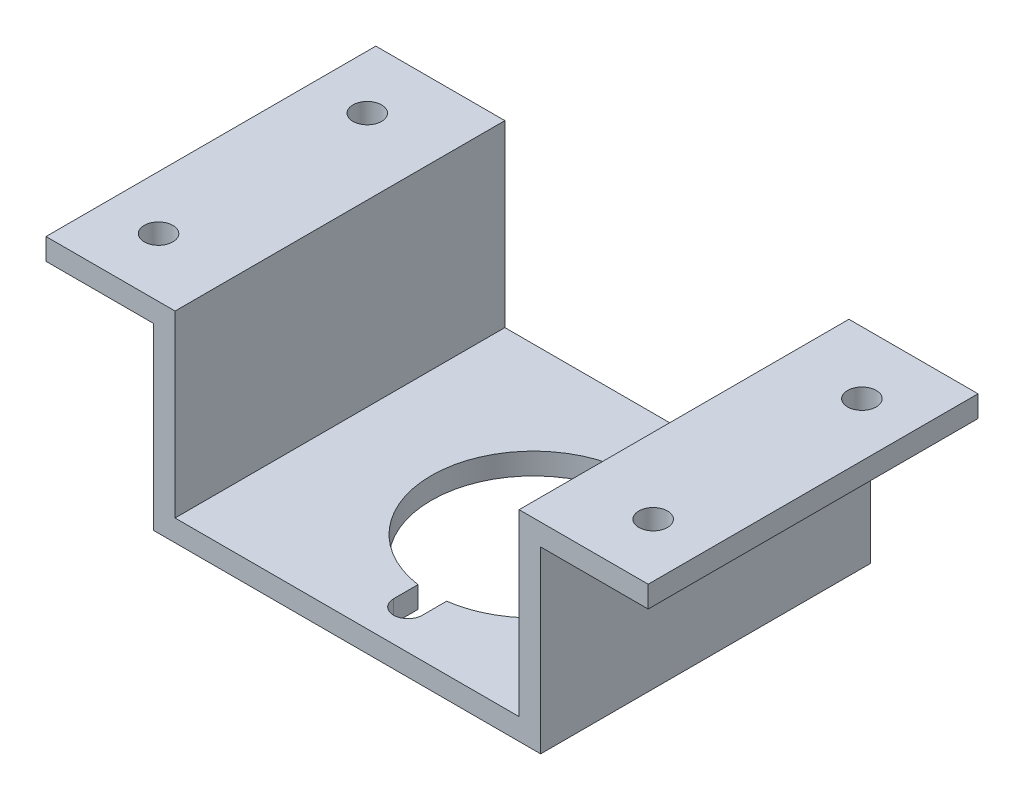
ISO-10303-21;
HEADER;
FILE_DESCRIPTION(('STEP AP214'),'2;1');
FILE_NAME('part.step','',(''),(''),'','','');
FILE_SCHEMA(('AUTOMOTIVE_DESIGN { 1 0 10303 214 1 1 1 1 }'));
ENDSEC;
DATA;
#1=APPLICATION_CONTEXT('core data for automotive mechanical design processes');
#2=APPLICATION_PROTOCOL_DEFINITION('international standard','automotive_design',2000,#1);
#3=PRODUCT_CONTEXT('',#1,'mechanical');
#4=PRODUCT('Part','Part','',(#3));
#5=PRODUCT_RELATED_PRODUCT_CATEGORY('part','',(#4));
#6=PRODUCT_DEFINITION_FORMATION('','',#4);
#7=PRODUCT_DEFINITION_CONTEXT('part definition',#1,'design');
#8=PRODUCT_DEFINITION('design','',#6,#7);
#9=PRODUCT_DEFINITION_SHAPE('','',#8);
#10=(LENGTH_UNIT() NAMED_UNIT(*) SI_UNIT(.MILLI.,.METRE.));
#11=(NAMED_UNIT(*) PLANE_ANGLE_UNIT() SI_UNIT($,.RADIAN.));
#12=(NAMED_UNIT(*) SI_UNIT($,.STERADIAN.) SOLID_ANGLE_UNIT());
#13=UNCERTAINTY_MEASURE_WITH_UNIT(LENGTH_MEASURE(1.E-05),#10,'distance_accuracy_value','');
#14=(GEOMETRIC_REPRESENTATION_CONTEXT(3) GLOBAL_UNCERTAINTY_ASSIGNED_CONTEXT((#13)) GLOBAL_UNIT_ASSIGNED_CONTEXT((#10,
#11,#12)) REPRESENTATION_CONTEXT('',''));
#15=CARTESIAN_POINT('',(0.,0.,0.));
#16=DIRECTION('',(0.,0.,1.));
#17=DIRECTION('',(1.,0.,0.));
#18=AXIS2_PLACEMENT_3D('',#15,#16,#17);
#19=CARTESIAN_POINT('',(-23.0659831417121,3.,-17.384827493882));
#20=DIRECTION('',(1.,0.,0.));
#21=DIRECTION('',(0.,0.,-1.));
#22=AXIS2_PLACEMENT_3D('',#19,#20,#21);
#23=PLANE('',#22);
#24=DIRECTION('',(0.,-1.,0.));
#25=VECTOR('',#24,1.);
#26=CARTESIAN_POINT('',(-23.0659831417121,28.,28.615172506118));
#27=LINE('',#26,#25);
#28=CARTESIAN_POINT('',(-23.0659831417121,25.,28.615172506118));
#29=VERTEX_POINT('',#28);
#30=CARTESIAN_POINT('',(-23.0659831417121,3.,28.615172506118));
#31=VERTEX_POINT('',#30);
#32=EDGE_CURVE('E58',#29,#31,#27,.T.);
#33=ORIENTED_EDGE('',*,*,#32,.F.);
#34=DIRECTION('',(0.,0.,1.));
#35=VECTOR('',#34,1.);
#36=CARTESIAN_POINT('',(-23.0659831417121,25.,-17.384827493882));
#37=LINE('',#36,#35);
#38=CARTESIAN_POINT('',(-23.0659831417121,25.,-17.384827493882));
#39=VERTEX_POINT('',#38);
#40=EDGE_CURVE('E291',#39,#29,#37,.T.);
#41=ORIENTED_EDGE('',*,*,#40,.F.);
#42=DIRECTION('',(0.,1.,0.));
#43=VECTOR('',#42,1.);
#44=CARTESIAN_POINT('',(-23.0659831417121,3.,-17.384827493882));
#45=LINE('',#44,#43);
#46=CARTESIAN_POINT('',(-23.0659831417121,0.,-17.384827493882));
#47=VERTEX_POINT('',#46);
#48=EDGE_CURVE('E340',#47,#39,#45,.T.);
#49=ORIENTED_EDGE('',*,*,#48,.F.);
#50=DIRECTION('',(0.,0.,1.));
#51=VECTOR('',#50,1.);
#52=CARTESIAN_POINT('',(-23.0659831417121,0.,-17.384827493882));
#53=LINE('',#52,#51);
#54=CARTESIAN_POINT('',(-23.0659831417121,0.,-14.384827493882));
#55=VERTEX_POINT('',#54);
#56=EDGE_CURVE('E345',#47,#55,#53,.T.);
#57=ORIENTED_EDGE('',*,*,#56,.T.);
#58=DIRECTION('',(0.,1.,0.));
#59=VECTOR('',#58,1.);
#60=CARTESIAN_POINT('',(-23.0659831417121,3.,-14.384827493882));
#61=LINE('',#60,#59);
#62=CARTESIAN_POINT('',(-23.0659831417121,3.,-14.384827493882));
#63=VERTEX_POINT('',#62);
#64=EDGE_CURVE('E337',#55,#63,#61,.T.);
#65=ORIENTED_EDGE('',*,*,#64,.T.);
#66=DIRECTION('',(0.,0.,1.));
#67=VECTOR('',#66,1.);
#68=CARTESIAN_POINT('',(-23.0659831417121,3.,-17.384827493882));
#69=LINE('',#68,#67);
#70=EDGE_CURVE('E296',#63,#31,#69,.T.);
#71=ORIENTED_EDGE('',*,*,#70,.T.);
#72=EDGE_LOOP('',(#33,#41,#49,#57,#65,#71));
#73=FACE_BOUND('',#72,.T.);
#74=ADVANCED_FACE('F35',(#73),#23,.F.);
#75=CARTESIAN_POINT('',(0.,3.,0.));
#76=DIRECTION('',(0.,1.,0.));
#77=DIRECTION('',(0.,0.,1.));
#78=AXIS2_PLACEMENT_3D('',#75,#76,#77);
#79=PLANE('',#78);
#80=DIRECTION('',(-1.,0.,0.));
#81=VECTOR('',#80,1.);
#82=CARTESIAN_POINT('',(-23.079062607331,3.,28.615172506118));
#83=LINE('',#82,#81);
#84=CARTESIAN_POINT('',(-23.079062607331,3.,28.615172506118));
#85=VERTEX_POINT('',#84);
#86=EDGE_CURVE('E334',#31,#85,#83,.T.);
#87=ORIENTED_EDGE('',*,*,#86,.F.);
#88=ORIENTED_EDGE('',*,*,#70,.F.);
#89=DIRECTION('',(-1.,0.,0.));
#90=VECTOR('',#89,1.);
#91=CARTESIAN_POINT('',(-23.079062607331,3.,-14.384827493882));
#92=LINE('',#91,#90);
#93=CARTESIAN_POINT('',(-23.079062607331,3.,-14.384827493882));
#94=VERTEX_POINT('',#93);
#95=EDGE_CURVE('E459',#63,#94,#92,.T.);
#96=ORIENTED_EDGE('',*,*,#95,.T.);
#97=DIRECTION('',(0.,0.,1.));
#98=VECTOR('',#97,1.);
#99=CARTESIAN_POINT('',(-23.079062607331,3.,-14.384827493882));
#100=LINE('',#99,#98);
#101=EDGE_CURVE('E456',#94,#85,#100,.T.);
#102=ORIENTED_EDGE('',*,*,#101,.T.);
#103=EDGE_LOOP('',(#87,#88,#96,#102));
#104=FACE_BOUND('',#103,.T.);
#105=ADVANCED_FACE('F553',(#104),#79,.T.);
#106=DIRECTION('',(0.,0.,-1.));
#107=VECTOR('',#106,1.);
#108=CARTESIAN_POINT('',(8.92093739266903,3.,23.115172506118));
#109=LINE('',#108,#107);
#110=CARTESIAN_POINT('',(8.92093739266903,3.,23.115172506118));
#111=VERTEX_POINT('',#110);
#112=CARTESIAN_POINT('',(8.92093739266903,3.,19.7241235656404));
#113=VERTEX_POINT('',#112);
#114=EDGE_CURVE('E354',#111,#113,#109,.T.);
#115=ORIENTED_EDGE('',*,*,#114,.F.);
#116=CARTESIAN_POINT('',(6.92093739266903,3.,23.115172506118));
#117=DIRECTION('',(0.,1.,0.));
#118=DIRECTION('',(0.,0.,1.));
#119=AXIS2_PLACEMENT_3D('',#116,#117,#118);
#120=CIRCLE('',#119,2.);
#121=CARTESIAN_POINT('',(4.92093739266903,3.,23.115172506118));
#122=VERTEX_POINT('',#121);
#123=EDGE_CURVE('E452',#122,#111,#120,.T.);
#124=ORIENTED_EDGE('',*,*,#123,.F.);
#125=DIRECTION('',(0.,0.,1.));
#126=VECTOR('',#125,1.);
#127=CARTESIAN_POINT('',(4.92093739266903,3.,-11.884827493882));
#128=LINE('',#127,#126);
#129=CARTESIAN_POINT('',(4.92093739266903,3.,19.7241235656405));
#130=VERTEX_POINT('',#129);
#131=EDGE_CURVE('E350',#130,#122,#128,.T.);
#132=ORIENTED_EDGE('',*,*,#131,.F.);
#133=CARTESIAN_POINT('',(6.92093739266903,3.,5.61517250611799));
#134=DIRECTION('',(0.,1.,0.));
#135=DIRECTION('',(0.,0.,1.));
#136=AXIS2_PLACEMENT_3D('',#133,#134,#135);
#137=CIRCLE('',#136,14.25);
#138=CARTESIAN_POINT('',(4.92093739266903,3.,-8.49377855340447));
#139=VERTEX_POINT('',#138);
#140=EDGE_CURVE('E421',#139,#130,#137,.T.);
#141=ORIENTED_EDGE('',*,*,#140,.F.);
#142=CARTESIAN_POINT('',(4.92093739266903,3.,-11.884827493882));
#143=VERTEX_POINT('',#142);
#144=EDGE_CURVE('E351',#143,#139,#128,.T.);
#145=ORIENTED_EDGE('',*,*,#144,.F.);
#146=CARTESIAN_POINT('',(6.92093739266903,3.,-11.884827493882));
#147=DIRECTION('',(0.,1.,0.));
#148=DIRECTION('',(0.,0.,1.));
#149=AXIS2_PLACEMENT_3D('',#146,#147,#148);
#150=CIRCLE('',#149,2.);
#151=CARTESIAN_POINT('',(8.92093739266903,3.,-11.884827493882));
#152=VERTEX_POINT('',#151);
#153=EDGE_CURVE('E437',#152,#143,#150,.T.);
#154=ORIENTED_EDGE('',*,*,#153,.F.);
#155=CARTESIAN_POINT('',(8.92093739266903,3.,-8.49377855340447));
#156=VERTEX_POINT('',#155);
#157=EDGE_CURVE('E353',#156,#152,#109,.T.);
#158=ORIENTED_EDGE('',*,*,#157,.F.);
#159=CARTESIAN_POINT('',(17.2661053468397,3.,-4.18482749388201));
#160=VERTEX_POINT('',#159);
#161=EDGE_CURVE('E417',#160,#156,#137,.T.);
#162=ORIENTED_EDGE('',*,*,#161,.F.);
#163=DIRECTION('',(-1.,0.,0.));
#164=VECTOR('',#163,1.);
#165=CARTESIAN_POINT('',(0.,3.,-4.18482749388201));
#166=LINE('',#165,#164);
#167=CARTESIAN_POINT('',(19.5682815384209,3.,-4.18482749388201));
#168=VERTEX_POINT('',#167);
#169=EDGE_CURVE('E384',#168,#160,#166,.T.);
#170=ORIENTED_EDGE('',*,*,#169,.F.);
#171=CARTESIAN_POINT('',(6.92093739266903,3.,5.61517250611799));
#172=DIRECTION('',(0.,1.,0.));
#173=DIRECTION('',(0.,0.,1.));
#174=AXIS2_PLACEMENT_3D('',#171,#172,#173);
#175=CIRCLE('',#174,15.9998535599887);
#176=CARTESIAN_POINT('',(21.1066807267733,3.,-1.78482749388201));
#177=VERTEX_POINT('',#176);
#178=EDGE_CURVE('E381',#177,#168,#175,.T.);
#179=ORIENTED_EDGE('',*,*,#178,.F.);
#180=DIRECTION('',(1.,0.,0.));
#181=VECTOR('',#180,1.);
#182=CARTESIAN_POINT('',(0.,3.,-1.78482749388201));
#183=LINE('',#182,#181);
#184=CARTESIAN_POINT('',(24.920937392669,3.,-1.78482749388201));
#185=VERTEX_POINT('',#184);
#186=EDGE_CURVE('E448',#177,#185,#183,.T.);
#187=ORIENTED_EDGE('',*,*,#186,.T.);
#188=DIRECTION('',(0.,0.,-1.));
#189=VECTOR('',#188,1.);
#190=CARTESIAN_POINT('',(24.920937392669,3.,13.015172506118));
#191=LINE('',#190,#189);
#192=CARTESIAN_POINT('',(24.920937392669,3.,13.015172506118));
#193=VERTEX_POINT('',#192);
#194=EDGE_CURVE('E424',#193,#185,#191,.T.);
#195=ORIENTED_EDGE('',*,*,#194,.F.);
#196=DIRECTION('',(1.,0.,0.));
#197=VECTOR('',#196,1.);
#198=CARTESIAN_POINT('',(0.,3.,13.015172506118));
#199=LINE('',#198,#197);
#200=CARTESIAN_POINT('',(21.1066807267733,3.,13.015172506118));
#201=VERTEX_POINT('',#200);
#202=EDGE_CURVE('E450',#201,#193,#199,.T.);
#203=ORIENTED_EDGE('',*,*,#202,.F.);
#204=CARTESIAN_POINT('',(6.92093739266903,3.,5.61517250611799));
#205=DIRECTION('',(0.,1.,0.));
#206=DIRECTION('',(0.,0.,1.));
#207=AXIS2_PLACEMENT_3D('',#204,#205,#206);
#208=CIRCLE('',#207,15.9998535599887);
#209=CARTESIAN_POINT('',(19.5682815384209,3.,15.415172506118));
#210=VERTEX_POINT('',#209);
#211=EDGE_CURVE('E395',#210,#201,#208,.T.);
#212=ORIENTED_EDGE('',*,*,#211,.F.);
#213=DIRECTION('',(-1.,0.,0.));
#214=VECTOR('',#213,1.);
#215=CARTESIAN_POINT('',(0.,3.,15.415172506118));
#216=LINE('',#215,#214);
#217=CARTESIAN_POINT('',(17.2661053468397,3.,15.415172506118));
#218=VERTEX_POINT('',#217);
#219=EDGE_CURVE('E392',#210,#218,#216,.T.);
#220=ORIENTED_EDGE('',*,*,#219,.T.);
#221=EDGE_CURVE('E415',#113,#218,#137,.T.);
#222=ORIENTED_EDGE('',*,*,#221,.F.);
#223=EDGE_LOOP('',(#115,#124,#132,#141,#145,#154,#158,#162,#170,#179,#187,#195,#203,#212,#220,#222));
#224=FACE_BOUND('',#223,.T.);
#225=DIRECTION('',(1.,0.,0.));
#226=VECTOR('',#225,1.);
#227=CARTESIAN_POINT('',(26.920937392669,3.,-17.384827493882));
#228=LINE('',#227,#226);
#229=CARTESIAN_POINT('',(-20.0659831417121,3.,-17.384827493882));
#230=VERTEX_POINT('',#229);
#231=CARTESIAN_POINT('',(27.920937392669,3.,-17.384827493882));
#232=VERTEX_POINT('',#231);
#233=EDGE_CURVE('E343',#230,#232,#228,.T.);
#234=ORIENTED_EDGE('',*,*,#233,.F.);
#235=DIRECTION('',(0.,0.,-1.));
#236=VECTOR('',#235,1.);
#237=CARTESIAN_POINT('',(-20.0659831417121,3.,-17.384827493882));
#238=LINE('',#237,#236);
#239=CARTESIAN_POINT('',(-20.0659831417121,3.,28.615172506118));
#240=VERTEX_POINT('',#239);
#241=EDGE_CURVE('E249',#240,#230,#238,.T.);
#242=ORIENTED_EDGE('',*,*,#241,.F.);
#243=CARTESIAN_POINT('',(27.920937392669,3.,28.615172506118));
#244=VERTEX_POINT('',#243);
#245=EDGE_CURVE('E335',#244,#240,#83,.T.);
#246=ORIENTED_EDGE('',*,*,#245,.F.);
#247=DIRECTION('',(0.,0.,1.));
#248=VECTOR('',#247,1.);
#249=CARTESIAN_POINT('',(27.920937392669,3.,-17.384827493882));
#250=LINE('',#249,#248);
#251=EDGE_CURVE('E307',#232,#244,#250,.T.);
#252=ORIENTED_EDGE('',*,*,#251,.F.);
#253=EDGE_LOOP('',(#234,#242,#246,#252));
#254=FACE_BOUND('',#253,.T.);
#255=ADVANCED_FACE('F481',(#224,#254),#79,.T.);
#256=CARTESIAN_POINT('',(-23.079062607331,3.,-14.384827493882));
#257=DIRECTION('',(0.,0.,1.));
#258=DIRECTION('',(1.,0.,0.));
#259=AXIS2_PLACEMENT_3D('',#256,#257,#258);
#260=PLANE('',#259);
#261=ORIENTED_EDGE('',*,*,#64,.F.);
#262=DIRECTION('',(-1.,0.,0.));
#263=VECTOR('',#262,1.);
#264=CARTESIAN_POINT('',(-23.079062607331,0.,-14.384827493882));
#265=LINE('',#264,#263);
#266=CARTESIAN_POINT('',(-23.079062607331,0.,-14.384827493882));
#267=VERTEX_POINT('',#266);
#268=EDGE_CURVE('E460',#55,#267,#265,.T.);
#269=ORIENTED_EDGE('',*,*,#268,.T.);
#270=DIRECTION('',(0.,-1.,0.));
#271=VECTOR('',#270,1.);
#272=CARTESIAN_POINT('',(-23.079062607331,3.,-14.384827493882));
#273=LINE('',#272,#271);
#274=EDGE_CURVE('E462',#94,#267,#273,.T.);
#275=ORIENTED_EDGE('',*,*,#274,.F.);
#276=ORIENTED_EDGE('',*,*,#95,.F.);
#277=EDGE_LOOP('',(#261,#269,#275,#276));
#278=FACE_BOUND('',#277,.T.);
#279=ADVANCED_FACE('F635',(#278),#260,.F.);
#280=CARTESIAN_POINT('',(6.92093739266903,4.,5.61517250611799));
#281=DIRECTION('',(0.,-1.,0.));
#282=DIRECTION('',(0.,0.,-1.));
#283=AXIS2_PLACEMENT_3D('',#280,#281,#282);
#284=CYLINDRICAL_SURFACE('',#283,14.25);
#285=ORIENTED_EDGE('',*,*,#161,.T.);
#286=DIRECTION('',(0.,-1.,0.));
#287=VECTOR('',#286,1.);
#288=CARTESIAN_POINT('',(8.92093739266903,4.,-8.49377855340447));
#289=LINE('',#288,#287);
#290=CARTESIAN_POINT('',(8.92093739266903,0.,-8.49377855340447));
#291=VERTEX_POINT('',#290);
#292=EDGE_CURVE('E371',#156,#291,#289,.T.);
#293=ORIENTED_EDGE('',*,*,#292,.T.);
#294=CARTESIAN_POINT('',(6.92093739266903,0.,5.61517250611799));
#295=DIRECTION('',(0.,-1.,0.));
#296=DIRECTION('',(0.,0.,-1.));
#297=AXIS2_PLACEMENT_3D('',#294,#295,#296);
#298=CIRCLE('',#297,14.25);
#299=CARTESIAN_POINT('',(17.2661053468397,0.,-4.18482749388201));
#300=VERTEX_POINT('',#299);
#301=EDGE_CURVE('E411',#291,#300,#298,.T.);
#302=ORIENTED_EDGE('',*,*,#301,.T.);
#303=DIRECTION('',(0.,-1.,0.));
#304=VECTOR('',#303,1.);
#305=CARTESIAN_POINT('',(17.2661053468397,4.,-4.18482749388201));
#306=LINE('',#305,#304);
#307=EDGE_CURVE('E470',#300,#160,#306,.F.);
#308=ORIENTED_EDGE('',*,*,#307,.T.);
#309=EDGE_LOOP('',(#285,#293,#302,#308));
#310=FACE_BOUND('',#309,.T.);
#311=ADVANCED_FACE('F515',(#310),#284,.F.);
#312=CARTESIAN_POINT('',(17.2661053468397,0.,15.415172506118));
#313=VERTEX_POINT('',#312);
#314=CARTESIAN_POINT('',(8.92093739266903,0.,19.7241235656404));
#315=VERTEX_POINT('',#314);
#316=EDGE_CURVE('E412',#313,#315,#298,.T.);
#317=ORIENTED_EDGE('',*,*,#316,.T.);
#318=DIRECTION('',(0.,-1.,0.));
#319=VECTOR('',#318,1.);
#320=CARTESIAN_POINT('',(8.92093739266903,4.,19.7241235656404));
#321=LINE('',#320,#319);
#322=EDGE_CURVE('E377',#315,#113,#321,.F.);
#323=ORIENTED_EDGE('',*,*,#322,.T.);
#324=ORIENTED_EDGE('',*,*,#221,.T.);
#325=DIRECTION('',(0.,-1.,0.));
#326=VECTOR('',#325,1.);
#327=CARTESIAN_POINT('',(17.2661053468397,4.,15.415172506118));
#328=LINE('',#327,#326);
#329=EDGE_CURVE('E467',#313,#218,#328,.F.);
#330=ORIENTED_EDGE('',*,*,#329,.F.);
#331=EDGE_LOOP('',(#317,#323,#324,#330));
#332=FACE_BOUND('',#331,.T.);
#333=ADVANCED_FACE('F490',(#332),#284,.F.);
#334=CARTESIAN_POINT('',(0.,0.,0.));
#335=DIRECTION('',(0.,1.,0.));
#336=DIRECTION('',(0.,0.,1.));
#337=AXIS2_PLACEMENT_3D('',#334,#335,#336);
#338=PLANE('',#337);
#339=DIRECTION('',(0.,0.,1.));
#340=VECTOR('',#339,1.);
#341=CARTESIAN_POINT('',(-23.079062607331,0.,-14.384827493882));
#342=LINE('',#341,#340);
#343=CARTESIAN_POINT('',(-23.079062607331,0.,28.615172506118));
#344=VERTEX_POINT('',#343);
#345=EDGE_CURVE('E455',#267,#344,#342,.T.);
#346=ORIENTED_EDGE('',*,*,#345,.F.);
#347=ORIENTED_EDGE('',*,*,#268,.F.);
#348=ORIENTED_EDGE('',*,*,#56,.F.);
#349=DIRECTION('',(-1.,0.,0.));
#350=VECTOR('',#349,1.);
#351=CARTESIAN_POINT('',(26.920937392669,0.,-17.384827493882));
#352=LINE('',#351,#350);
#353=CARTESIAN_POINT('',(30.920937392669,0.,-17.384827493882));
#354=VERTEX_POINT('',#353);
#355=EDGE_CURVE('E338',#354,#47,#352,.T.);
#356=ORIENTED_EDGE('',*,*,#355,.F.);
#357=DIRECTION('',(0.,0.,-1.));
#358=VECTOR('',#357,1.);
#359=CARTESIAN_POINT('',(30.920937392669,0.,28.615172506118));
#360=LINE('',#359,#358);
#361=CARTESIAN_POINT('',(30.920937392669,0.,28.615172506118));
#362=VERTEX_POINT('',#361);
#363=EDGE_CURVE('E324',#362,#354,#360,.T.);
#364=ORIENTED_EDGE('',*,*,#363,.F.);
#365=DIRECTION('',(1.,0.,0.));
#366=VECTOR('',#365,1.);
#367=CARTESIAN_POINT('',(-23.079062607331,0.,28.615172506118));
#368=LINE('',#367,#366);
#369=EDGE_CURVE('E331',#344,#362,#368,.T.);
#370=ORIENTED_EDGE('',*,*,#369,.F.);
#371=EDGE_LOOP('',(#346,#347,#348,#356,#364,#370));
#372=FACE_BOUND('',#371,.T.);
#373=CARTESIAN_POINT('',(6.92093739266903,0.,23.115172506118));
#374=DIRECTION('',(0.,-1.,0.));
#375=DIRECTION('',(0.,0.,-1.));
#376=AXIS2_PLACEMENT_3D('',#373,#374,#375);
#377=CIRCLE('',#376,2.);
#378=CARTESIAN_POINT('',(8.92093739266903,0.,23.115172506118));
#379=VERTEX_POINT('',#378);
#380=CARTESIAN_POINT('',(4.92093739266903,0.,23.115172506118));
#381=VERTEX_POINT('',#380);
#382=EDGE_CURVE('E434',#379,#381,#377,.T.);
#383=ORIENTED_EDGE('',*,*,#382,.F.);
#384=DIRECTION('',(0.,0.,-1.));
#385=VECTOR('',#384,1.);
#386=CARTESIAN_POINT('',(8.92093739266903,0.,0.));
#387=LINE('',#386,#385);
#388=EDGE_CURVE('E378',#379,#315,#387,.T.);
#389=ORIENTED_EDGE('',*,*,#388,.T.);
#390=ORIENTED_EDGE('',*,*,#316,.F.);
#391=DIRECTION('',(-1.,0.,0.));
#392=VECTOR('',#391,1.);
#393=CARTESIAN_POINT('',(0.,0.,15.415172506118));
#394=LINE('',#393,#392);
#395=CARTESIAN_POINT('',(19.5682815384209,0.,15.415172506118));
#396=VERTEX_POINT('',#395);
#397=EDGE_CURVE('E390',#396,#313,#394,.T.);
#398=ORIENTED_EDGE('',*,*,#397,.F.);
#399=CARTESIAN_POINT('',(6.92093739266903,0.,5.61517250611799));
#400=DIRECTION('',(0.,1.,0.));
#401=DIRECTION('',(0.,0.,1.));
#402=AXIS2_PLACEMENT_3D('',#399,#400,#401);
#403=CIRCLE('',#402,15.9998535599887);
#404=CARTESIAN_POINT('',(21.1066807267733,0.,13.015172506118));
#405=VERTEX_POINT('',#404);
#406=EDGE_CURVE('E408',#396,#405,#403,.T.);
#407=ORIENTED_EDGE('',*,*,#406,.T.);
#408=DIRECTION('',(-1.,0.,0.));
#409=VECTOR('',#408,1.);
#410=CARTESIAN_POINT('',(0.,0.,13.015172506118));
#411=LINE('',#410,#409);
#412=CARTESIAN_POINT('',(24.920937392669,0.,13.015172506118));
#413=VERTEX_POINT('',#412);
#414=EDGE_CURVE('E439',#413,#405,#411,.T.);
#415=ORIENTED_EDGE('',*,*,#414,.F.);
#416=DIRECTION('',(0.,0.,1.));
#417=VECTOR('',#416,1.);
#418=CARTESIAN_POINT('',(24.920937392669,0.,13.015172506118));
#419=LINE('',#418,#417);
#420=CARTESIAN_POINT('',(24.920937392669,0.,-1.78482749388201));
#421=VERTEX_POINT('',#420);
#422=EDGE_CURVE('E430',#421,#413,#419,.T.);
#423=ORIENTED_EDGE('',*,*,#422,.F.);
#424=DIRECTION('',(-1.,0.,0.));
#425=VECTOR('',#424,1.);
#426=CARTESIAN_POINT('',(0.,0.,-1.78482749388201));
#427=LINE('',#426,#425);
#428=CARTESIAN_POINT('',(21.1066807267733,0.,-1.78482749388201));
#429=VERTEX_POINT('',#428);
#430=EDGE_CURVE('E438',#421,#429,#427,.T.);
#431=ORIENTED_EDGE('',*,*,#430,.T.);
#432=CARTESIAN_POINT('',(6.92093739266903,0.,5.61517250611799));
#433=DIRECTION('',(0.,1.,0.));
#434=DIRECTION('',(0.,0.,1.));
#435=AXIS2_PLACEMENT_3D('',#432,#433,#434);
#436=CIRCLE('',#435,15.9998535599887);
#437=CARTESIAN_POINT('',(19.5682815384209,0.,-4.18482749388201));
#438=VERTEX_POINT('',#437);
#439=EDGE_CURVE('E405',#429,#438,#436,.T.);
#440=ORIENTED_EDGE('',*,*,#439,.T.);
#441=DIRECTION('',(-1.,0.,0.));
#442=VECTOR('',#441,1.);
#443=CARTESIAN_POINT('',(0.,0.,-4.18482749388201));
#444=LINE('',#443,#442);
#445=EDGE_CURVE('E402',#438,#300,#444,.T.);
#446=ORIENTED_EDGE('',*,*,#445,.T.);
#447=ORIENTED_EDGE('',*,*,#301,.F.);
#448=CARTESIAN_POINT('',(8.92093739266903,0.,-11.884827493882));
#449=VERTEX_POINT('',#448);
#450=EDGE_CURVE('E374',#291,#449,#387,.T.);
#451=ORIENTED_EDGE('',*,*,#450,.T.);
#452=CARTESIAN_POINT('',(6.92093739266903,0.,-11.884827493882));
#453=DIRECTION('',(0.,-1.,0.));
#454=DIRECTION('',(0.,0.,-1.));
#455=AXIS2_PLACEMENT_3D('',#452,#453,#454);
#456=CIRCLE('',#455,2.);
#457=CARTESIAN_POINT('',(4.92093739266903,0.,-11.884827493882));
#458=VERTEX_POINT('',#457);
#459=EDGE_CURVE('E433',#458,#449,#456,.T.);
#460=ORIENTED_EDGE('',*,*,#459,.F.);
#461=DIRECTION('',(0.,0.,1.));
#462=VECTOR('',#461,1.);
#463=CARTESIAN_POINT('',(4.92093739266903,0.,0.));
#464=LINE('',#463,#462);
#465=CARTESIAN_POINT('',(4.92093739266903,0.,-8.49377855340447));
#466=VERTEX_POINT('',#465);
#467=EDGE_CURVE('E368',#458,#466,#464,.T.);
#468=ORIENTED_EDGE('',*,*,#467,.T.);
#469=CARTESIAN_POINT('',(4.92093739266903,0.,19.7241235656405));
#470=VERTEX_POINT('',#469);
#471=EDGE_CURVE('E416',#470,#466,#298,.T.);
#472=ORIENTED_EDGE('',*,*,#471,.F.);
#473=EDGE_CURVE('E364',#470,#381,#464,.T.);
#474=ORIENTED_EDGE('',*,*,#473,.T.);
#475=EDGE_LOOP('',(#383,#389,#390,#398,#407,#415,#423,#431,#440,#446,#447,#451,#460,#468,#472,#474));
#476=FACE_BOUND('',#475,.T.);
#477=ADVANCED_FACE('F495',(#372,#476),#338,.F.);
#478=ORIENTED_EDGE('',*,*,#471,.T.);
#479=DIRECTION('',(0.,-1.,0.));
#480=VECTOR('',#479,1.);
#481=CARTESIAN_POINT('',(4.92093739266903,4.,-8.49377855340447));
#482=LINE('',#481,#480);
#483=EDGE_CURVE('E367',#466,#139,#482,.F.);
#484=ORIENTED_EDGE('',*,*,#483,.T.);
#485=ORIENTED_EDGE('',*,*,#140,.T.);
#486=DIRECTION('',(0.,-1.,0.));
#487=VECTOR('',#486,1.);
#488=CARTESIAN_POINT('',(4.92093739266903,4.,19.7241235656405));
#489=LINE('',#488,#487);
#490=EDGE_CURVE('E360',#130,#470,#489,.T.);
#491=ORIENTED_EDGE('',*,*,#490,.T.);
#492=EDGE_LOOP('',(#478,#484,#485,#491));
#493=FACE_BOUND('',#492,.T.);
#494=ADVANCED_FACE('F501',(#493),#284,.F.);
#495=CARTESIAN_POINT('',(-23.079062607331,3.,-14.384827493882));
#496=DIRECTION('',(1.,0.,0.));
#497=DIRECTION('',(0.,0.,-1.));
#498=AXIS2_PLACEMENT_3D('',#495,#496,#497);
#499=PLANE('',#498);
#500=ORIENTED_EDGE('',*,*,#345,.T.);
#501=DIRECTION('',(0.,-1.,0.));
#502=VECTOR('',#501,1.);
#503=CARTESIAN_POINT('',(-23.079062607331,3.,28.615172506118));
#504=LINE('',#503,#502);
#505=EDGE_CURVE('E329',#85,#344,#504,.T.);
#506=ORIENTED_EDGE('',*,*,#505,.F.);
#507=ORIENTED_EDGE('',*,*,#101,.F.);
#508=ORIENTED_EDGE('',*,*,#274,.T.);
#509=EDGE_LOOP('',(#500,#506,#507,#508));
#510=FACE_BOUND('',#509,.T.);
#511=ADVANCED_FACE('F37',(#510),#499,.F.);
#512=CARTESIAN_POINT('',(6.92093739266903,5.,-11.884827493882));
#513=DIRECTION('',(0.,-1.,0.));
#514=DIRECTION('',(0.,0.,-1.));
#515=AXIS2_PLACEMENT_3D('',#512,#513,#514);
#516=CYLINDRICAL_SURFACE('',#515,2.);
#517=ORIENTED_EDGE('',*,*,#459,.T.);
#518=DIRECTION('',(0.,1.,0.));
#519=VECTOR('',#518,1.);
#520=CARTESIAN_POINT('',(8.92093739266903,-2.,-11.884827493882));
#521=LINE('',#520,#519);
#522=EDGE_CURVE('E357',#449,#152,#521,.T.);
#523=ORIENTED_EDGE('',*,*,#522,.T.);
#524=ORIENTED_EDGE('',*,*,#153,.T.);
#525=DIRECTION('',(0.,1.,0.));
#526=VECTOR('',#525,1.);
#527=CARTESIAN_POINT('',(4.92093739266903,-2.,-11.884827493882));
#528=LINE('',#527,#526);
#529=EDGE_CURVE('E356',#458,#143,#528,.T.);
#530=ORIENTED_EDGE('',*,*,#529,.F.);
#531=EDGE_LOOP('',(#517,#523,#524,#530));
#532=FACE_BOUND('',#531,.T.);
#533=ADVANCED_FACE('F508',(#532),#516,.F.);
#534=CARTESIAN_POINT('',(0.,5.,13.015172506118));
#535=DIRECTION('',(0.,0.,1.));
#536=DIRECTION('',(1.,0.,0.));
#537=AXIS2_PLACEMENT_3D('',#534,#535,#536);
#538=PLANE('',#537);
#539=ORIENTED_EDGE('',*,*,#414,.T.);
#540=DIRECTION('',(0.,1.,0.));
#541=VECTOR('',#540,1.);
#542=CARTESIAN_POINT('',(21.1066807267733,-1.,13.015172506118));
#543=LINE('',#542,#541);
#544=EDGE_CURVE('E385',#405,#201,#543,.T.);
#545=ORIENTED_EDGE('',*,*,#544,.T.);
#546=ORIENTED_EDGE('',*,*,#202,.T.);
#547=DIRECTION('',(0.,1.,0.));
#548=VECTOR('',#547,1.);
#549=CARTESIAN_POINT('',(24.920937392669,0.,13.015172506118));
#550=LINE('',#549,#548);
#551=EDGE_CURVE('E420',#413,#193,#550,.T.);
#552=ORIENTED_EDGE('',*,*,#551,.F.);
#553=EDGE_LOOP('',(#539,#545,#546,#552));
#554=FACE_BOUND('',#553,.T.);
#555=ADVANCED_FACE('F536',(#554),#538,.F.);
#556=CARTESIAN_POINT('',(0.,5.,-1.78482749388201));
#557=DIRECTION('',(0.,0.,1.));
#558=DIRECTION('',(1.,0.,0.));
#559=AXIS2_PLACEMENT_3D('',#556,#557,#558);
#560=PLANE('',#559);
#561=DIRECTION('',(0.,1.,0.));
#562=VECTOR('',#561,1.);
#563=CARTESIAN_POINT('',(21.1066807267733,-1.,-1.78482749388201));
#564=LINE('',#563,#562);
#565=EDGE_CURVE('E387',#429,#177,#564,.T.);
#566=ORIENTED_EDGE('',*,*,#565,.F.);
#567=ORIENTED_EDGE('',*,*,#430,.F.);
#568=DIRECTION('',(0.,-1.,0.));
#569=VECTOR('',#568,1.);
#570=CARTESIAN_POINT('',(24.920937392669,0.,-1.78482749388201));
#571=LINE('',#570,#569);
#572=EDGE_CURVE('E427',#185,#421,#571,.T.);
#573=ORIENTED_EDGE('',*,*,#572,.F.);
#574=ORIENTED_EDGE('',*,*,#186,.F.);
#575=EDGE_LOOP('',(#566,#567,#573,#574));
#576=FACE_BOUND('',#575,.T.);
#577=ADVANCED_FACE('F528',(#576),#560,.T.);
#578=CARTESIAN_POINT('',(6.92093739266903,5.,23.115172506118));
#579=DIRECTION('',(0.,-1.,0.));
#580=DIRECTION('',(0.,0.,-1.));
#581=AXIS2_PLACEMENT_3D('',#578,#579,#580);
#582=CYLINDRICAL_SURFACE('',#581,2.);
#583=ORIENTED_EDGE('',*,*,#123,.T.);
#584=DIRECTION('',(0.,-1.,0.));
#585=VECTOR('',#584,1.);
#586=CARTESIAN_POINT('',(8.92093739266903,5.,23.115172506118));
#587=LINE('',#586,#585);
#588=EDGE_CURVE('E11',#111,#379,#587,.T.);
#589=ORIENTED_EDGE('',*,*,#588,.T.);
#590=ORIENTED_EDGE('',*,*,#382,.T.);
#591=DIRECTION('',(0.,-1.,0.));
#592=VECTOR('',#591,1.);
#593=CARTESIAN_POINT('',(4.92093739266903,5.,23.115172506118));
#594=LINE('',#593,#592);
#595=EDGE_CURVE('E43',#381,#122,#594,.F.);
#596=ORIENTED_EDGE('',*,*,#595,.T.);
#597=EDGE_LOOP('',(#583,#589,#590,#596));
#598=FACE_BOUND('',#597,.T.);
#599=ADVANCED_FACE('F475',(#598),#582,.F.);
#600=CARTESIAN_POINT('',(24.920937392669,0.,0.));
#601=DIRECTION('',(-1.,0.,0.));
#602=DIRECTION('',(0.,0.,1.));
#603=AXIS2_PLACEMENT_3D('',#600,#601,#602);
#604=PLANE('',#603);
#605=ORIENTED_EDGE('',*,*,#551,.T.);
#606=ORIENTED_EDGE('',*,*,#194,.T.);
#607=ORIENTED_EDGE('',*,*,#572,.T.);
#608=ORIENTED_EDGE('',*,*,#422,.T.);
#609=EDGE_LOOP('',(#605,#606,#607,#608));
#610=FACE_BOUND('',#609,.T.);
#611=ADVANCED_FACE('F531',(#610),#604,.T.);
#612=CARTESIAN_POINT('',(6.92093739266903,-1.,5.61517250611799));
#613=DIRECTION('',(0.,1.,0.));
#614=DIRECTION('',(0.,0.,1.));
#615=AXIS2_PLACEMENT_3D('',#612,#613,#614);
#616=CYLINDRICAL_SURFACE('',#615,15.9998535599887);
#617=DIRECTION('',(0.,1.,0.));
#618=VECTOR('',#617,1.);
#619=CARTESIAN_POINT('',(19.5682815384209,-1.,15.415172506118));
#620=LINE('',#619,#618);
#621=EDGE_CURVE('E397',#396,#210,#620,.T.);
#622=ORIENTED_EDGE('',*,*,#621,.T.);
#623=ORIENTED_EDGE('',*,*,#211,.T.);
#624=ORIENTED_EDGE('',*,*,#544,.F.);
#625=ORIENTED_EDGE('',*,*,#406,.F.);
#626=EDGE_LOOP('',(#622,#623,#624,#625));
#627=FACE_BOUND('',#626,.T.);
#628=ADVANCED_FACE('F538',(#627),#616,.F.);
#629=CARTESIAN_POINT('',(0.,-1.,15.415172506118));
#630=DIRECTION('',(0.,0.,-1.));
#631=DIRECTION('',(-1.,0.,0.));
#632=AXIS2_PLACEMENT_3D('',#629,#630,#631);
#633=PLANE('',#632);
#634=ORIENTED_EDGE('',*,*,#397,.T.);
#635=ORIENTED_EDGE('',*,*,#329,.T.);
#636=ORIENTED_EDGE('',*,*,#219,.F.);
#637=ORIENTED_EDGE('',*,*,#621,.F.);
#638=EDGE_LOOP('',(#634,#635,#636,#637));
#639=FACE_BOUND('',#638,.T.);
#640=ADVANCED_FACE('F542',(#639),#633,.T.);
#641=CARTESIAN_POINT('',(6.92093739266903,-1.,5.61517250611799));
#642=DIRECTION('',(0.,1.,0.));
#643=DIRECTION('',(0.,0.,1.));
#644=AXIS2_PLACEMENT_3D('',#641,#642,#643);
#645=CYLINDRICAL_SURFACE('',#644,15.9998535599887);
#646=ORIENTED_EDGE('',*,*,#565,.T.);
#647=ORIENTED_EDGE('',*,*,#178,.T.);
#648=DIRECTION('',(0.,1.,0.));
#649=VECTOR('',#648,1.);
#650=CARTESIAN_POINT('',(19.5682815384209,-1.,-4.18482749388201));
#651=LINE('',#650,#649);
#652=EDGE_CURVE('E388',#438,#168,#651,.T.);
#653=ORIENTED_EDGE('',*,*,#652,.F.);
#654=ORIENTED_EDGE('',*,*,#439,.F.);
#655=EDGE_LOOP('',(#646,#647,#653,#654));
#656=FACE_BOUND('',#655,.T.);
#657=ADVANCED_FACE('F540',(#656),#645,.F.);
#658=CARTESIAN_POINT('',(0.,-1.,-4.18482749388201));
#659=DIRECTION('',(0.,0.,-1.));
#660=DIRECTION('',(-1.,0.,0.));
#661=AXIS2_PLACEMENT_3D('',#658,#659,#660);
#662=PLANE('',#661);
#663=ORIENTED_EDGE('',*,*,#652,.T.);
#664=ORIENTED_EDGE('',*,*,#169,.T.);
#665=ORIENTED_EDGE('',*,*,#307,.F.);
#666=ORIENTED_EDGE('',*,*,#445,.F.);
#667=EDGE_LOOP('',(#663,#664,#665,#666));
#668=FACE_BOUND('',#667,.T.);
#669=ADVANCED_FACE('F518',(#668),#662,.F.);
#670=CARTESIAN_POINT('',(4.92093739266903,-2.,-11.884827493882));
#671=DIRECTION('',(-1.,0.,0.));
#672=DIRECTION('',(0.,0.,1.));
#673=AXIS2_PLACEMENT_3D('',#670,#671,#672);
#674=PLANE('',#673);
#675=ORIENTED_EDGE('',*,*,#490,.F.);
#676=ORIENTED_EDGE('',*,*,#131,.T.);
#677=ORIENTED_EDGE('',*,*,#595,.F.);
#678=ORIENTED_EDGE('',*,*,#473,.F.);
#679=EDGE_LOOP('',(#675,#676,#677,#678));
#680=FACE_BOUND('',#679,.T.);
#681=ADVANCED_FACE('F499',(#680),#674,.F.);
#682=CARTESIAN_POINT('',(8.92093739266903,-2.,23.115172506118));
#683=DIRECTION('',(1.,0.,0.));
#684=DIRECTION('',(0.,0.,-1.));
#685=AXIS2_PLACEMENT_3D('',#682,#683,#684);
#686=PLANE('',#685);
#687=ORIENTED_EDGE('',*,*,#588,.F.);
#688=ORIENTED_EDGE('',*,*,#114,.T.);
#689=ORIENTED_EDGE('',*,*,#322,.F.);
#690=ORIENTED_EDGE('',*,*,#388,.F.);
#691=EDGE_LOOP('',(#687,#688,#689,#690));
#692=FACE_BOUND('',#691,.T.);
#693=ADVANCED_FACE('F487',(#692),#686,.F.);
#694=ORIENTED_EDGE('',*,*,#529,.T.);
#695=ORIENTED_EDGE('',*,*,#144,.T.);
#696=ORIENTED_EDGE('',*,*,#483,.F.);
#697=ORIENTED_EDGE('',*,*,#467,.F.);
#698=EDGE_LOOP('',(#694,#695,#696,#697));
#699=FACE_BOUND('',#698,.T.);
#700=ADVANCED_FACE('F567',(#699),#674,.F.);
#701=ORIENTED_EDGE('',*,*,#292,.F.);
#702=ORIENTED_EDGE('',*,*,#157,.T.);
#703=ORIENTED_EDGE('',*,*,#522,.F.);
#704=ORIENTED_EDGE('',*,*,#450,.F.);
#705=EDGE_LOOP('',(#701,#702,#703,#704));
#706=FACE_BOUND('',#705,.T.);
#707=ADVANCED_FACE('F511',(#706),#686,.F.);
#708=CARTESIAN_POINT('',(0.,0.,-17.384827493882));
#709=DIRECTION('',(0.,0.,-1.));
#710=DIRECTION('',(-1.,0.,0.));
#711=AXIS2_PLACEMENT_3D('',#708,#709,#710);
#712=PLANE('',#711);
#713=ORIENTED_EDGE('',*,*,#48,.T.);
#714=DIRECTION('',(1.,0.,0.));
#715=VECTOR('',#714,1.);
#716=CARTESIAN_POINT('',(-38.0659831417121,25.,-17.384827493882));
#717=LINE('',#716,#715);
#718=CARTESIAN_POINT('',(-38.0659831417121,25.,-17.384827493882));
#719=VERTEX_POINT('',#718);
#720=EDGE_CURVE('E259',#719,#39,#717,.T.);
#721=ORIENTED_EDGE('',*,*,#720,.F.);
#722=DIRECTION('',(0.,-1.,0.));
#723=VECTOR('',#722,1.);
#724=CARTESIAN_POINT('',(-38.0659831417121,28.,-17.384827493882));
#725=LINE('',#724,#723);
#726=CARTESIAN_POINT('',(-38.0659831417121,28.,-17.384827493882));
#727=VERTEX_POINT('',#726);
#728=EDGE_CURVE('E292',#727,#719,#725,.T.);
#729=ORIENTED_EDGE('',*,*,#728,.F.);
#730=DIRECTION('',(-1.,0.,0.));
#731=VECTOR('',#730,1.);
#732=CARTESIAN_POINT('',(-23.0659831417121,28.,-17.384827493882));
#733=LINE('',#732,#731);
#734=CARTESIAN_POINT('',(-20.0659831417121,28.,-17.384827493882));
#735=VERTEX_POINT('',#734);
#736=EDGE_CURVE('E255',#735,#727,#733,.T.);
#737=ORIENTED_EDGE('',*,*,#736,.F.);
#738=DIRECTION('',(0.,-1.,0.));
#739=VECTOR('',#738,1.);
#740=CARTESIAN_POINT('',(-20.0659831417121,28.,-17.384827493882));
#741=LINE('',#740,#739);
#742=EDGE_CURVE('E300',#735,#230,#741,.T.);
#743=ORIENTED_EDGE('',*,*,#742,.T.);
#744=ORIENTED_EDGE('',*,*,#233,.T.);
#745=DIRECTION('',(0.,-1.,0.));
#746=VECTOR('',#745,1.);
#747=CARTESIAN_POINT('',(27.920937392669,28.,-17.384827493882));
#748=LINE('',#747,#746);
#749=CARTESIAN_POINT('',(27.920937392669,28.,-17.384827493882));
#750=VERTEX_POINT('',#749);
#751=EDGE_CURVE('E319',#750,#232,#748,.T.);
#752=ORIENTED_EDGE('',*,*,#751,.F.);
#753=DIRECTION('',(-1.,0.,0.));
#754=VECTOR('',#753,1.);
#755=CARTESIAN_POINT('',(30.920937392669,28.,-17.384827493882));
#756=LINE('',#755,#754);
#757=CARTESIAN_POINT('',(45.920937392669,28.,-17.384827493882));
#758=VERTEX_POINT('',#757);
#759=EDGE_CURVE('E308',#758,#750,#756,.T.);
#760=ORIENTED_EDGE('',*,*,#759,.F.);
#761=DIRECTION('',(0.,1.,0.));
#762=VECTOR('',#761,1.);
#763=CARTESIAN_POINT('',(45.920937392669,28.,-17.384827493882));
#764=LINE('',#763,#762);
#765=CARTESIAN_POINT('',(45.920937392669,25.,-17.384827493882));
#766=VERTEX_POINT('',#765);
#767=EDGE_CURVE('E278',#766,#758,#764,.T.);
#768=ORIENTED_EDGE('',*,*,#767,.F.);
#769=DIRECTION('',(-1.,0.,0.));
#770=VECTOR('',#769,1.);
#771=CARTESIAN_POINT('',(45.920937392669,25.,-17.384827493882));
#772=LINE('',#771,#770);
#773=CARTESIAN_POINT('',(30.920937392669,25.,-17.384827493882));
#774=VERTEX_POINT('',#773);
#775=EDGE_CURVE('E284',#766,#774,#772,.T.);
#776=ORIENTED_EDGE('',*,*,#775,.T.);
#777=DIRECTION('',(0.,1.,0.));
#778=VECTOR('',#777,1.);
#779=CARTESIAN_POINT('',(30.920937392669,3.,-17.384827493882));
#780=LINE('',#779,#778);
#781=EDGE_CURVE('E327',#354,#774,#780,.T.);
#782=ORIENTED_EDGE('',*,*,#781,.F.);
#783=ORIENTED_EDGE('',*,*,#355,.T.);
#784=EDGE_LOOP('',(#713,#721,#729,#737,#743,#744,#752,#760,#768,#776,#782,#783));
#785=FACE_BOUND('',#784,.T.);
#786=ADVANCED_FACE('F563',(#785),#712,.T.);
#787=CARTESIAN_POINT('',(0.,0.,28.615172506118));
#788=DIRECTION('',(0.,0.,1.));
#789=DIRECTION('',(1.,0.,0.));
#790=AXIS2_PLACEMENT_3D('',#787,#788,#789);
#791=PLANE('',#790);
#792=ORIENTED_EDGE('',*,*,#505,.T.);
#793=ORIENTED_EDGE('',*,*,#369,.T.);
#794=DIRECTION('',(0.,-1.,0.));
#795=VECTOR('',#794,1.);
#796=CARTESIAN_POINT('',(30.920937392669,3.,28.615172506118));
#797=LINE('',#796,#795);
#798=CARTESIAN_POINT('',(30.920937392669,25.,28.615172506118));
#799=VERTEX_POINT('',#798);
#800=EDGE_CURVE('E322',#799,#362,#797,.T.);
#801=ORIENTED_EDGE('',*,*,#800,.F.);
#802=DIRECTION('',(-1.,0.,0.));
#803=VECTOR('',#802,1.);
#804=CARTESIAN_POINT('',(45.920937392669,25.,28.615172506118));
#805=LINE('',#804,#803);
#806=CARTESIAN_POINT('',(45.920937392669,25.,28.615172506118));
#807=VERTEX_POINT('',#806);
#808=EDGE_CURVE('E288',#807,#799,#805,.T.);
#809=ORIENTED_EDGE('',*,*,#808,.F.);
#810=DIRECTION('',(0.,-1.,0.));
#811=VECTOR('',#810,1.);
#812=CARTESIAN_POINT('',(45.920937392669,28.,28.615172506118));
#813=LINE('',#812,#811);
#814=CARTESIAN_POINT('',(45.920937392669,28.,28.615172506118));
#815=VERTEX_POINT('',#814);
#816=EDGE_CURVE('E273',#815,#807,#813,.T.);
#817=ORIENTED_EDGE('',*,*,#816,.F.);
#818=DIRECTION('',(1.,0.,0.));
#819=VECTOR('',#818,1.);
#820=CARTESIAN_POINT('',(30.920937392669,28.,28.615172506118));
#821=LINE('',#820,#819);
#822=CARTESIAN_POINT('',(27.920937392669,28.,28.615172506118));
#823=VERTEX_POINT('',#822);
#824=EDGE_CURVE('E312',#823,#815,#821,.T.);
#825=ORIENTED_EDGE('',*,*,#824,.F.);
#826=DIRECTION('',(0.,-1.,0.));
#827=VECTOR('',#826,1.);
#828=CARTESIAN_POINT('',(27.920937392669,28.,28.615172506118));
#829=LINE('',#828,#827);
#830=EDGE_CURVE('E314',#823,#244,#829,.T.);
#831=ORIENTED_EDGE('',*,*,#830,.T.);
#832=ORIENTED_EDGE('',*,*,#245,.T.);
#833=DIRECTION('',(0.,-1.,0.));
#834=VECTOR('',#833,1.);
#835=CARTESIAN_POINT('',(-20.0659831417121,28.,28.615172506118));
#836=LINE('',#835,#834);
#837=CARTESIAN_POINT('',(-20.0659831417121,28.,28.615172506118));
#838=VERTEX_POINT('',#837);
#839=EDGE_CURVE('E245',#838,#240,#836,.T.);
#840=ORIENTED_EDGE('',*,*,#839,.F.);
#841=DIRECTION('',(1.,0.,0.));
#842=VECTOR('',#841,1.);
#843=CARTESIAN_POINT('',(-23.0659831417121,28.,28.615172506118));
#844=LINE('',#843,#842);
#845=CARTESIAN_POINT('',(-38.0659831417121,28.,28.615172506118));
#846=VERTEX_POINT('',#845);
#847=EDGE_CURVE('E238',#846,#838,#844,.T.);
#848=ORIENTED_EDGE('',*,*,#847,.F.);
#849=DIRECTION('',(0.,1.,0.));
#850=VECTOR('',#849,1.);
#851=CARTESIAN_POINT('',(-38.0659831417121,28.,28.615172506118));
#852=LINE('',#851,#850);
#853=CARTESIAN_POINT('',(-38.0659831417121,25.,28.615172506118));
#854=VERTEX_POINT('',#853);
#855=EDGE_CURVE('E243',#854,#846,#852,.T.);
#856=ORIENTED_EDGE('',*,*,#855,.F.);
#857=DIRECTION('',(1.,0.,0.));
#858=VECTOR('',#857,1.);
#859=CARTESIAN_POINT('',(-38.0659831417121,25.,28.615172506118));
#860=LINE('',#859,#858);
#861=EDGE_CURVE('E264',#854,#29,#860,.T.);
#862=ORIENTED_EDGE('',*,*,#861,.T.);
#863=ORIENTED_EDGE('',*,*,#32,.T.);
#864=ORIENTED_EDGE('',*,*,#86,.T.);
#865=EDGE_LOOP('',(#792,#793,#801,#809,#817,#825,#831,#832,#840,#848,#856,#862,#863,#864));
#866=FACE_BOUND('',#865,.T.);
#867=ADVANCED_FACE('F241',(#866),#791,.T.);
#868=CARTESIAN_POINT('',(30.920937392669,0.,0.));
#869=DIRECTION('',(1.,0.,0.));
#870=DIRECTION('',(0.,0.,-1.));
#871=AXIS2_PLACEMENT_3D('',#868,#869,#870);
#872=PLANE('',#871);
#873=DIRECTION('',(0.,0.,-1.));
#874=VECTOR('',#873,1.);
#875=CARTESIAN_POINT('',(30.920937392669,25.,28.615172506118));
#876=LINE('',#875,#874);
#877=EDGE_CURVE('E50',#799,#774,#876,.T.);
#878=ORIENTED_EDGE('',*,*,#877,.F.);
#879=ORIENTED_EDGE('',*,*,#800,.T.);
#880=ORIENTED_EDGE('',*,*,#363,.T.);
#881=ORIENTED_EDGE('',*,*,#781,.T.);
#882=EDGE_LOOP('',(#878,#879,#880,#881));
#883=FACE_BOUND('',#882,.T.);
#884=ADVANCED_FACE('F656',(#883),#872,.T.);
#885=CARTESIAN_POINT('',(27.920937392669,28.,-17.384827493882));
#886=DIRECTION('',(1.,0.,0.));
#887=DIRECTION('',(0.,0.,-1.));
#888=AXIS2_PLACEMENT_3D('',#885,#886,#887);
#889=PLANE('',#888);
#890=ORIENTED_EDGE('',*,*,#251,.T.);
#891=ORIENTED_EDGE('',*,*,#830,.F.);
#892=DIRECTION('',(0.,0.,1.));
#893=VECTOR('',#892,1.);
#894=CARTESIAN_POINT('',(27.920937392669,28.,-17.384827493882));
#895=LINE('',#894,#893);
#896=EDGE_CURVE('E310',#750,#823,#895,.T.);
#897=ORIENTED_EDGE('',*,*,#896,.F.);
#898=ORIENTED_EDGE('',*,*,#751,.T.);
#899=EDGE_LOOP('',(#890,#891,#897,#898));
#900=FACE_BOUND('',#899,.T.);
#901=ADVANCED_FACE('F650',(#900),#889,.F.);
#902=CARTESIAN_POINT('',(0.,28.,0.));
#903=DIRECTION('',(0.,-1.,0.));
#904=DIRECTION('',(0.,0.,-1.));
#905=AXIS2_PLACEMENT_3D('',#902,#903,#904);
#906=PLANE('',#905);
#907=CARTESIAN_POINT('',(38.420937392669,28.,20.4195203322049));
#908=DIRECTION('',(0.,-1.,0.));
#909=DIRECTION('',(0.,0.,-1.));
#910=AXIS2_PLACEMENT_3D('',#907,#908,#909);
#911=CIRCLE('',#910,2.);
#912=CARTESIAN_POINT('',(38.420937392669,28.,18.4195203322049));
#913=VERTEX_POINT('',#912);
#914=EDGE_CURVE('E265',#913,#913,#911,.T.);
#915=ORIENTED_EDGE('',*,*,#914,.T.);
#916=EDGE_LOOP('',(#915));
#917=FACE_BOUND('',#916,.T.);
#918=CARTESIAN_POINT('',(38.420937392669,28.,-8.69241374694101));
#919=DIRECTION('',(0.,-1.,0.));
#920=DIRECTION('',(0.,0.,-1.));
#921=AXIS2_PLACEMENT_3D('',#918,#919,#920);
#922=CIRCLE('',#921,2.);
#923=CARTESIAN_POINT('',(38.420937392669,28.,-10.692413746941));
#924=VERTEX_POINT('',#923);
#925=EDGE_CURVE('E269',#924,#924,#922,.T.);
#926=ORIENTED_EDGE('',*,*,#925,.T.);
#927=EDGE_LOOP('',(#926));
#928=FACE_BOUND('',#927,.T.);
#929=ORIENTED_EDGE('',*,*,#824,.T.);
#930=DIRECTION('',(0.,0.,1.));
#931=VECTOR('',#930,1.);
#932=CARTESIAN_POINT('',(45.920937392669,28.,28.615172506118));
#933=LINE('',#932,#931);
#934=EDGE_CURVE('E281',#758,#815,#933,.T.);
#935=ORIENTED_EDGE('',*,*,#934,.F.);
#936=ORIENTED_EDGE('',*,*,#759,.T.);
#937=ORIENTED_EDGE('',*,*,#896,.T.);
#938=EDGE_LOOP('',(#929,#935,#936,#937));
#939=FACE_BOUND('',#938,.T.);
#940=ADVANCED_FACE('F655',(#917,#928,#939),#906,.F.);
#941=CARTESIAN_POINT('',(-20.0659831417121,28.,-17.384827493882));
#942=DIRECTION('',(-1.,0.,0.));
#943=DIRECTION('',(0.,0.,1.));
#944=AXIS2_PLACEMENT_3D('',#941,#942,#943);
#945=PLANE('',#944);
#946=ORIENTED_EDGE('',*,*,#241,.T.);
#947=ORIENTED_EDGE('',*,*,#742,.F.);
#948=DIRECTION('',(0.,0.,-1.));
#949=VECTOR('',#948,1.);
#950=CARTESIAN_POINT('',(-20.0659831417121,28.,-17.384827493882));
#951=LINE('',#950,#949);
#952=EDGE_CURVE('E248',#838,#735,#951,.T.);
#953=ORIENTED_EDGE('',*,*,#952,.F.);
#954=ORIENTED_EDGE('',*,*,#839,.T.);
#955=EDGE_LOOP('',(#946,#947,#953,#954));
#956=FACE_BOUND('',#955,.T.);
#957=ADVANCED_FACE('F666',(#956),#945,.F.);
#958=CARTESIAN_POINT('',(0.,28.,0.));
#959=DIRECTION('',(0.,1.,0.));
#960=DIRECTION('',(0.,0.,1.));
#961=AXIS2_PLACEMENT_3D('',#958,#959,#960);
#962=PLANE('',#961);
#963=CARTESIAN_POINT('',(-30.5659831417121,28.,20.4195203322049));
#964=DIRECTION('',(0.,1.,0.));
#965=DIRECTION('',(0.,0.,1.));
#966=AXIS2_PLACEMENT_3D('',#963,#964,#965);
#967=CIRCLE('',#966,2.);
#968=CARTESIAN_POINT('',(-30.5659831417121,28.,22.4195203322049));
#969=VERTEX_POINT('',#968);
#970=EDGE_CURVE('E806',#969,#969,#967,.T.);
#971=ORIENTED_EDGE('',*,*,#970,.F.);
#972=EDGE_LOOP('',(#971));
#973=FACE_BOUND('',#972,.T.);
#974=CARTESIAN_POINT('',(-30.5659831417121,28.,-8.69241374694101));
#975=DIRECTION('',(0.,1.,0.));
#976=DIRECTION('',(0.,0.,1.));
#977=AXIS2_PLACEMENT_3D('',#974,#975,#976);
#978=CIRCLE('',#977,2.);
#979=CARTESIAN_POINT('',(-30.5659831417121,28.,-6.69241374694101));
#980=VERTEX_POINT('',#979);
#981=EDGE_CURVE('E810',#980,#980,#978,.T.);
#982=ORIENTED_EDGE('',*,*,#981,.F.);
#983=EDGE_LOOP('',(#982));
#984=FACE_BOUND('',#983,.T.);
#985=DIRECTION('',(0.,0.,-1.));
#986=VECTOR('',#985,1.);
#987=CARTESIAN_POINT('',(-38.0659831417121,28.,-17.384827493882));
#988=LINE('',#987,#986);
#989=EDGE_CURVE('E252',#846,#727,#988,.T.);
#990=ORIENTED_EDGE('',*,*,#989,.F.);
#991=ORIENTED_EDGE('',*,*,#847,.T.);
#992=ORIENTED_EDGE('',*,*,#952,.T.);
#993=ORIENTED_EDGE('',*,*,#736,.T.);
#994=EDGE_LOOP('',(#990,#991,#992,#993));
#995=FACE_BOUND('',#994,.T.);
#996=ADVANCED_FACE('F253',(#973,#984,#995),#962,.T.);
#997=CARTESIAN_POINT('',(-38.0659831417121,25.,-17.384827493882));
#998=DIRECTION('',(0.,1.,0.));
#999=DIRECTION('',(0.,0.,1.));
#1000=AXIS2_PLACEMENT_3D('',#997,#998,#999);
#1001=PLANE('',#1000);
#1002=CARTESIAN_POINT('',(-30.5659831417121,25.,20.4195203322049));
#1003=DIRECTION('',(0.,-1.,0.));
#1004=DIRECTION('',(0.,0.,-1.));
#1005=AXIS2_PLACEMENT_3D('',#1002,#1003,#1004);
#1006=CIRCLE('',#1005,2.);
#1007=CARTESIAN_POINT('',(-30.5659831417121,25.,18.419520332205));
#1008=VERTEX_POINT('',#1007);
#1009=EDGE_CURVE('E809',#1008,#1008,#1006,.T.);
#1010=ORIENTED_EDGE('',*,*,#1009,.F.);
#1011=EDGE_LOOP('',(#1010));
#1012=FACE_BOUND('',#1011,.T.);
#1013=CARTESIAN_POINT('',(-30.5659831417121,25.,-8.69241374694101));
#1014=DIRECTION('',(0.,-1.,0.));
#1015=DIRECTION('',(0.,0.,-1.));
#1016=AXIS2_PLACEMENT_3D('',#1013,#1014,#1015);
#1017=CIRCLE('',#1016,2.);
#1018=CARTESIAN_POINT('',(-30.5659831417121,25.,-10.692413746941));
#1019=VERTEX_POINT('',#1018);
#1020=EDGE_CURVE('E811',#1019,#1019,#1017,.T.);
#1021=ORIENTED_EDGE('',*,*,#1020,.F.);
#1022=EDGE_LOOP('',(#1021));
#1023=FACE_BOUND('',#1022,.T.);
#1024=ORIENTED_EDGE('',*,*,#40,.T.);
#1025=ORIENTED_EDGE('',*,*,#861,.F.);
#1026=DIRECTION('',(0.,0.,1.));
#1027=VECTOR('',#1026,1.);
#1028=CARTESIAN_POINT('',(-38.0659831417121,25.,-17.384827493882));
#1029=LINE('',#1028,#1027);
#1030=EDGE_CURVE('E260',#719,#854,#1029,.T.);
#1031=ORIENTED_EDGE('',*,*,#1030,.F.);
#1032=ORIENTED_EDGE('',*,*,#720,.T.);
#1033=EDGE_LOOP('',(#1024,#1025,#1031,#1032));
#1034=FACE_BOUND('',#1033,.T.);
#1035=ADVANCED_FACE('F728',(#1012,#1023,#1034),#1001,.F.);
#1036=CARTESIAN_POINT('',(-38.0659831417121,0.,0.));
#1037=DIRECTION('',(-1.,0.,0.));
#1038=DIRECTION('',(0.,0.,1.));
#1039=AXIS2_PLACEMENT_3D('',#1036,#1037,#1038);
#1040=PLANE('',#1039);
#1041=ORIENTED_EDGE('',*,*,#728,.T.);
#1042=ORIENTED_EDGE('',*,*,#1030,.T.);
#1043=ORIENTED_EDGE('',*,*,#855,.T.);
#1044=ORIENTED_EDGE('',*,*,#989,.T.);
#1045=EDGE_LOOP('',(#1041,#1042,#1043,#1044));
#1046=FACE_BOUND('',#1045,.T.);
#1047=ADVANCED_FACE('F262',(#1046),#1040,.T.);
#1048=CARTESIAN_POINT('',(45.920937392669,25.,28.615172506118));
#1049=DIRECTION('',(0.,1.,0.));
#1050=DIRECTION('',(0.,0.,1.));
#1051=AXIS2_PLACEMENT_3D('',#1048,#1049,#1050);
#1052=PLANE('',#1051);
#1053=CARTESIAN_POINT('',(38.420937392669,25.,20.4195203322049));
#1054=DIRECTION('',(0.,-1.,0.));
#1055=DIRECTION('',(0.,0.,-1.));
#1056=AXIS2_PLACEMENT_3D('',#1053,#1054,#1055);
#1057=CIRCLE('',#1056,2.);
#1058=CARTESIAN_POINT('',(38.420937392669,25.,18.4195203322049));
#1059=VERTEX_POINT('',#1058);
#1060=EDGE_CURVE('E820',#1059,#1059,#1057,.T.);
#1061=ORIENTED_EDGE('',*,*,#1060,.F.);
#1062=EDGE_LOOP('',(#1061));
#1063=FACE_BOUND('',#1062,.T.);
#1064=CARTESIAN_POINT('',(38.420937392669,25.,-8.69241374694101));
#1065=DIRECTION('',(0.,-1.,0.));
#1066=DIRECTION('',(0.,0.,-1.));
#1067=AXIS2_PLACEMENT_3D('',#1064,#1065,#1066);
#1068=CIRCLE('',#1067,2.);
#1069=CARTESIAN_POINT('',(38.420937392669,25.,-10.692413746941));
#1070=VERTEX_POINT('',#1069);
#1071=EDGE_CURVE('E819',#1070,#1070,#1068,.T.);
#1072=ORIENTED_EDGE('',*,*,#1071,.F.);
#1073=EDGE_LOOP('',(#1072));
#1074=FACE_BOUND('',#1073,.T.);
#1075=ORIENTED_EDGE('',*,*,#877,.T.);
#1076=ORIENTED_EDGE('',*,*,#775,.F.);
#1077=DIRECTION('',(0.,0.,-1.));
#1078=VECTOR('',#1077,1.);
#1079=CARTESIAN_POINT('',(45.920937392669,25.,28.615172506118));
#1080=LINE('',#1079,#1078);
#1081=EDGE_CURVE('E276',#807,#766,#1080,.T.);
#1082=ORIENTED_EDGE('',*,*,#1081,.F.);
#1083=ORIENTED_EDGE('',*,*,#808,.T.);
#1084=EDGE_LOOP('',(#1075,#1076,#1082,#1083));
#1085=FACE_BOUND('',#1084,.T.);
#1086=ADVANCED_FACE('F702',(#1063,#1074,#1085),#1052,.F.);
#1087=CARTESIAN_POINT('',(45.920937392669,0.,0.));
#1088=DIRECTION('',(1.,0.,0.));
#1089=DIRECTION('',(0.,0.,-1.));
#1090=AXIS2_PLACEMENT_3D('',#1087,#1088,#1089);
#1091=PLANE('',#1090);
#1092=ORIENTED_EDGE('',*,*,#816,.T.);
#1093=ORIENTED_EDGE('',*,*,#1081,.T.);
#1094=ORIENTED_EDGE('',*,*,#767,.T.);
#1095=ORIENTED_EDGE('',*,*,#934,.T.);
#1096=EDGE_LOOP('',(#1092,#1093,#1094,#1095));
#1097=FACE_BOUND('',#1096,.T.);
#1098=ADVANCED_FACE('F697',(#1097),#1091,.T.);
#1099=CARTESIAN_POINT('',(38.420937392669,40.,-8.69241374694101));
#1100=DIRECTION('',(0.,-1.,0.));
#1101=DIRECTION('',(0.,0.,-1.));
#1102=AXIS2_PLACEMENT_3D('',#1099,#1100,#1101);
#1103=CYLINDRICAL_SURFACE('',#1102,2.);
#1104=ORIENTED_EDGE('',*,*,#1071,.T.);
#1105=EDGE_LOOP('',(#1104));
#1106=FACE_BOUND('',#1105,.T.);
#1107=ORIENTED_EDGE('',*,*,#925,.F.);
#1108=EDGE_LOOP('',(#1107));
#1109=FACE_BOUND('',#1108,.T.);
#1110=ADVANCED_FACE('F701',(#1106,#1109),#1103,.F.);
#1111=CARTESIAN_POINT('',(38.420937392669,40.,20.4195203322049));
#1112=DIRECTION('',(0.,-1.,0.));
#1113=DIRECTION('',(0.,0.,-1.));
#1114=AXIS2_PLACEMENT_3D('',#1111,#1112,#1113);
#1115=CYLINDRICAL_SURFACE('',#1114,2.);
#1116=ORIENTED_EDGE('',*,*,#1060,.T.);
#1117=EDGE_LOOP('',(#1116));
#1118=FACE_BOUND('',#1117,.T.);
#1119=ORIENTED_EDGE('',*,*,#914,.F.);
#1120=EDGE_LOOP('',(#1119));
#1121=FACE_BOUND('',#1120,.T.);
#1122=ADVANCED_FACE('F753',(#1118,#1121),#1115,.F.);
#1123=CARTESIAN_POINT('',(-30.5659831417121,40.,-8.69241374694101));
#1124=DIRECTION('',(0.,-1.,0.));
#1125=DIRECTION('',(0.,0.,-1.));
#1126=AXIS2_PLACEMENT_3D('',#1123,#1124,#1125);
#1127=CYLINDRICAL_SURFACE('',#1126,2.);
#1128=ORIENTED_EDGE('',*,*,#981,.T.);
#1129=EDGE_LOOP('',(#1128));
#1130=FACE_BOUND('',#1129,.T.);
#1131=ORIENTED_EDGE('',*,*,#1020,.T.);
#1132=EDGE_LOOP('',(#1131));
#1133=FACE_BOUND('',#1132,.T.);
#1134=ADVANCED_FACE('F763',(#1130,#1133),#1127,.F.);
#1135=CARTESIAN_POINT('',(-30.5659831417121,40.,20.4195203322049));
#1136=DIRECTION('',(0.,-1.,0.));
#1137=DIRECTION('',(0.,0.,-1.));
#1138=AXIS2_PLACEMENT_3D('',#1135,#1136,#1137);
#1139=CYLINDRICAL_SURFACE('',#1138,2.);
#1140=ORIENTED_EDGE('',*,*,#970,.T.);
#1141=EDGE_LOOP('',(#1140));
#1142=FACE_BOUND('',#1141,.T.);
#1143=ORIENTED_EDGE('',*,*,#1009,.T.);
#1144=EDGE_LOOP('',(#1143));
#1145=FACE_BOUND('',#1144,.T.);
#1146=ADVANCED_FACE('F789',(#1142,#1145),#1139,.F.);
#1147=CLOSED_SHELL('',(#74,#105,#255,#279,#311,#333,#477,#494,#511,#533,#555,#577,#599,#611,
#628,#640,#657,#669,#681,#693,#700,#707,#786,#867,#884,#901,#940,#957,#996,#1035,#1047,#1086,
#1098,#1110,#1122,#1134,#1146));
#1148=MANIFOLD_SOLID_BREP('B2',#1147);
#1149=ADVANCED_BREP_SHAPE_REPRESENTATION('',(#18,#1148),#14);
#1150=SHAPE_DEFINITION_REPRESENTATION(#9,#1149);
ENDSEC;
END-ISO-10303-21;
